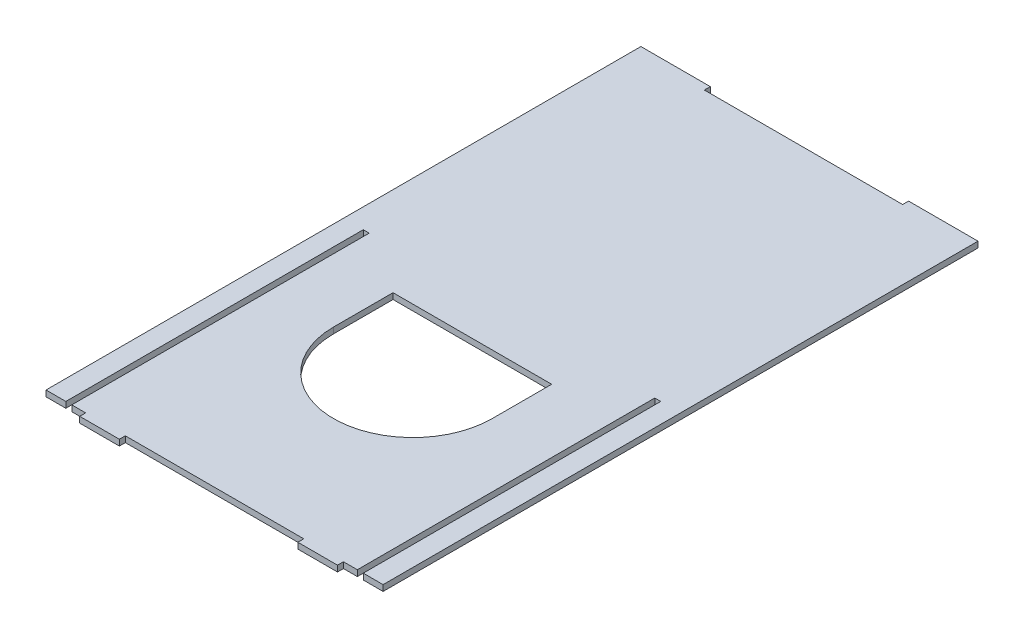
ISO-10303-21;
HEADER;
FILE_DESCRIPTION(('STEP AP214'),'2;1');
FILE_NAME('part.step','',(''),(''),'','','');
FILE_SCHEMA(('AUTOMOTIVE_DESIGN { 1 0 10303 214 1 1 1 1 }'));
ENDSEC;
DATA;
#1=APPLICATION_CONTEXT('core data for automotive mechanical design processes');
#2=APPLICATION_PROTOCOL_DEFINITION('international standard','automotive_design',2000,#1);
#3=PRODUCT_CONTEXT('',#1,'mechanical');
#4=PRODUCT('Part','Part','',(#3));
#5=PRODUCT_RELATED_PRODUCT_CATEGORY('part','',(#4));
#6=PRODUCT_DEFINITION_FORMATION('','',#4);
#7=PRODUCT_DEFINITION_CONTEXT('part definition',#1,'design');
#8=PRODUCT_DEFINITION('design','',#6,#7);
#9=PRODUCT_DEFINITION_SHAPE('','',#8);
#10=(LENGTH_UNIT() NAMED_UNIT(*) SI_UNIT(.MILLI.,.METRE.));
#11=(NAMED_UNIT(*) PLANE_ANGLE_UNIT() SI_UNIT($,.RADIAN.));
#12=(NAMED_UNIT(*) SI_UNIT($,.STERADIAN.) SOLID_ANGLE_UNIT());
#13=UNCERTAINTY_MEASURE_WITH_UNIT(LENGTH_MEASURE(1.E-05),#10,'distance_accuracy_value','');
#14=(GEOMETRIC_REPRESENTATION_CONTEXT(3) GLOBAL_UNCERTAINTY_ASSIGNED_CONTEXT((#13)) GLOBAL_UNIT_ASSIGNED_CONTEXT((#10,
#11,#12)) REPRESENTATION_CONTEXT('',''));
#15=CARTESIAN_POINT('',(0.,0.,0.));
#16=DIRECTION('',(0.,0.,1.));
#17=DIRECTION('',(1.,0.,0.));
#18=AXIS2_PLACEMENT_3D('',#15,#16,#17);
#19=CARTESIAN_POINT('',(0.,6.,-600.));
#20=DIRECTION('',(0.,0.,1.));
#21=DIRECTION('',(1.,0.,0.));
#22=AXIS2_PLACEMENT_3D('',#19,#20,#21);
#23=PLANE('',#22);
#24=DIRECTION('',(-1.,0.,0.));
#25=VECTOR('',#24,1.);
#26=CARTESIAN_POINT('',(0.,6.,-600.));
#27=LINE('',#26,#25);
#28=CARTESIAN_POINT('',(70.,6.,-600.));
#29=VERTEX_POINT('',#28);
#30=CARTESIAN_POINT('',(0.,6.,-600.));
#31=VERTEX_POINT('',#30);
#32=EDGE_CURVE('E363',#29,#31,#27,.T.);
#33=ORIENTED_EDGE('',*,*,#32,.F.);
#34=DIRECTION('',(0.,1.,0.));
#35=VECTOR('',#34,1.);
#36=CARTESIAN_POINT('',(70.,0.,-600.));
#37=LINE('',#36,#35);
#38=CARTESIAN_POINT('',(70.,0.,-600.));
#39=VERTEX_POINT('',#38);
#40=EDGE_CURVE('E270',#39,#29,#37,.T.);
#41=ORIENTED_EDGE('',*,*,#40,.F.);
#42=DIRECTION('',(-1.,0.,0.));
#43=VECTOR('',#42,1.);
#44=CARTESIAN_POINT('',(0.,0.,-600.));
#45=LINE('',#44,#43);
#46=CARTESIAN_POINT('',(0.,0.,-600.));
#47=VERTEX_POINT('',#46);
#48=EDGE_CURVE('E393',#39,#47,#45,.T.);
#49=ORIENTED_EDGE('',*,*,#48,.T.);
#50=DIRECTION('',(0.,-1.,0.));
#51=VECTOR('',#50,1.);
#52=CARTESIAN_POINT('',(0.,6.,-600.));
#53=LINE('',#52,#51);
#54=EDGE_CURVE('E401',#31,#47,#53,.T.);
#55=ORIENTED_EDGE('',*,*,#54,.F.);
#56=EDGE_LOOP('',(#33,#41,#49,#55));
#57=FACE_BOUND('',#56,.T.);
#58=ADVANCED_FACE('F39',(#57),#23,.F.);
#59=CARTESIAN_POINT('',(300.,6.,-2.10463319099841E-13));
#60=DIRECTION('',(0.,0.,-1.));
#61=DIRECTION('',(-1.,0.,0.));
#62=AXIS2_PLACEMENT_3D('',#59,#60,#61);
#63=PLANE('',#62);
#64=DIRECTION('',(1.,0.,0.));
#65=VECTOR('',#64,1.);
#66=CARTESIAN_POINT('',(300.,0.,-2.10463319099841E-13));
#67=LINE('',#66,#65);
#68=CARTESIAN_POINT('',(300.,0.,-2.10463319099841E-13));
#69=VERTEX_POINT('',#68);
#70=CARTESIAN_POINT('',(314.,0.,-3.31505656259168E-13));
#71=VERTEX_POINT('',#70);
#72=EDGE_CURVE('E388',#69,#71,#67,.T.);
#73=ORIENTED_EDGE('',*,*,#72,.T.);
#74=DIRECTION('',(0.,1.,0.));
#75=VECTOR('',#74,1.);
#76=CARTESIAN_POINT('',(314.,0.,-3.31505656259168E-13));
#77=LINE('',#76,#75);
#78=CARTESIAN_POINT('',(314.,6.,-3.31505656259168E-13));
#79=VERTEX_POINT('',#78);
#80=EDGE_CURVE('E297',#71,#79,#77,.T.);
#81=ORIENTED_EDGE('',*,*,#80,.T.);
#82=DIRECTION('',(1.,0.,0.));
#83=VECTOR('',#82,1.);
#84=CARTESIAN_POINT('',(300.,6.,-2.10463319099841E-13));
#85=LINE('',#84,#83);
#86=CARTESIAN_POINT('',(300.,6.,-2.10463319099841E-13));
#87=VERTEX_POINT('',#86);
#88=EDGE_CURVE('E358',#87,#79,#85,.T.);
#89=ORIENTED_EDGE('',*,*,#88,.F.);
#90=DIRECTION('',(0.,-1.,0.));
#91=VECTOR('',#90,1.);
#92=CARTESIAN_POINT('',(300.,6.,-2.10463319099841E-13));
#93=LINE('',#92,#91);
#94=EDGE_CURVE('E410',#87,#69,#93,.T.);
#95=ORIENTED_EDGE('',*,*,#94,.T.);
#96=EDGE_LOOP('',(#73,#81,#89,#95));
#97=FACE_BOUND('',#96,.T.);
#98=ADVANCED_FACE('F521',(#97),#63,.F.);
#99=CARTESIAN_POINT('',(40.,6.,0.));
#100=DIRECTION('',(0.,0.,-1.));
#101=DIRECTION('',(-1.,0.,0.));
#102=AXIS2_PLACEMENT_3D('',#99,#100,#101);
#103=PLANE('',#102);
#104=DIRECTION('',(1.,0.,0.));
#105=VECTOR('',#104,1.);
#106=CARTESIAN_POINT('',(40.,0.,0.));
#107=LINE('',#106,#105);
#108=CARTESIAN_POINT('',(0.,0.,0.));
#109=VERTEX_POINT('',#108);
#110=CARTESIAN_POINT('',(20.,0.,0.));
#111=VERTEX_POINT('',#110);
#112=EDGE_CURVE('E370',#109,#111,#107,.T.);
#113=ORIENTED_EDGE('',*,*,#112,.T.);
#114=DIRECTION('',(0.,1.,0.));
#115=VECTOR('',#114,1.);
#116=CARTESIAN_POINT('',(20.,0.,0.));
#117=LINE('',#116,#115);
#118=CARTESIAN_POINT('',(20.,6.,0.));
#119=VERTEX_POINT('',#118);
#120=EDGE_CURVE('E323',#111,#119,#117,.T.);
#121=ORIENTED_EDGE('',*,*,#120,.T.);
#122=DIRECTION('',(1.,0.,0.));
#123=VECTOR('',#122,1.);
#124=CARTESIAN_POINT('',(40.,6.,0.));
#125=LINE('',#124,#123);
#126=CARTESIAN_POINT('',(0.,6.,0.));
#127=VERTEX_POINT('',#126);
#128=EDGE_CURVE('E339',#127,#119,#125,.T.);
#129=ORIENTED_EDGE('',*,*,#128,.F.);
#130=DIRECTION('',(0.,-1.,0.));
#131=VECTOR('',#130,1.);
#132=CARTESIAN_POINT('',(0.,6.,0.));
#133=LINE('',#132,#131);
#134=EDGE_CURVE('E369',#127,#109,#133,.T.);
#135=ORIENTED_EDGE('',*,*,#134,.T.);
#136=EDGE_LOOP('',(#113,#121,#129,#135));
#137=FACE_BOUND('',#136,.T.);
#138=ADVANCED_FACE('F473',(#137),#103,.F.);
#139=CARTESIAN_POINT('',(26.,6.,0.));
#140=VERTEX_POINT('',#139);
#141=CARTESIAN_POINT('',(40.,6.,0.));
#142=VERTEX_POINT('',#141);
#143=EDGE_CURVE('E343',#140,#142,#125,.T.);
#144=ORIENTED_EDGE('',*,*,#143,.F.);
#145=DIRECTION('',(0.,1.,0.));
#146=VECTOR('',#145,1.);
#147=CARTESIAN_POINT('',(26.,0.,0.));
#148=LINE('',#147,#146);
#149=CARTESIAN_POINT('',(26.,0.,0.));
#150=VERTEX_POINT('',#149);
#151=EDGE_CURVE('E335',#150,#140,#148,.T.);
#152=ORIENTED_EDGE('',*,*,#151,.F.);
#153=CARTESIAN_POINT('',(40.,0.,0.));
#154=VERTEX_POINT('',#153);
#155=EDGE_CURVE('E332',#150,#154,#107,.T.);
#156=ORIENTED_EDGE('',*,*,#155,.T.);
#157=DIRECTION('',(0.,-1.,0.));
#158=VECTOR('',#157,1.);
#159=CARTESIAN_POINT('',(40.,6.,0.));
#160=LINE('',#159,#158);
#161=EDGE_CURVE('E11',#142,#154,#160,.T.);
#162=ORIENTED_EDGE('',*,*,#161,.F.);
#163=EDGE_LOOP('',(#144,#152,#156,#162));
#164=FACE_BOUND('',#163,.T.);
#165=ADVANCED_FACE('F41',(#164),#103,.F.);
#166=CARTESIAN_POINT('',(40.,6.,0.));
#167=DIRECTION('',(1.,0.,0.));
#168=DIRECTION('',(0.,0.,-1.));
#169=AXIS2_PLACEMENT_3D('',#166,#167,#168);
#170=PLANE('',#169);
#171=DIRECTION('',(0.,0.,1.));
#172=VECTOR('',#171,1.);
#173=CARTESIAN_POINT('',(40.,0.,0.));
#174=LINE('',#173,#172);
#175=CARTESIAN_POINT('',(40.,0.,6.00000000000003));
#176=VERTEX_POINT('',#175);
#177=EDGE_CURVE('E373',#154,#176,#174,.T.);
#178=ORIENTED_EDGE('',*,*,#177,.T.);
#179=DIRECTION('',(0.,-1.,0.));
#180=VECTOR('',#179,1.);
#181=CARTESIAN_POINT('',(40.,6.,6.00000000000003));
#182=LINE('',#181,#180);
#183=CARTESIAN_POINT('',(40.,6.,6.00000000000003));
#184=VERTEX_POINT('',#183);
#185=EDGE_CURVE('E47',#184,#176,#182,.T.);
#186=ORIENTED_EDGE('',*,*,#185,.F.);
#187=DIRECTION('',(0.,0.,1.));
#188=VECTOR('',#187,1.);
#189=CARTESIAN_POINT('',(40.,6.,0.));
#190=LINE('',#189,#188);
#191=EDGE_CURVE('E342',#142,#184,#190,.T.);
#192=ORIENTED_EDGE('',*,*,#191,.F.);
#193=ORIENTED_EDGE('',*,*,#161,.T.);
#194=EDGE_LOOP('',(#178,#186,#192,#193));
#195=FACE_BOUND('',#194,.T.);
#196=ADVANCED_FACE('F457',(#195),#170,.F.);
#197=CARTESIAN_POINT('',(40.,6.,6.00000000000003));
#198=DIRECTION('',(0.,0.,-1.));
#199=DIRECTION('',(-1.,0.,0.));
#200=AXIS2_PLACEMENT_3D('',#197,#198,#199);
#201=PLANE('',#200);
#202=DIRECTION('',(1.,0.,0.));
#203=VECTOR('',#202,1.);
#204=CARTESIAN_POINT('',(40.,0.,6.00000000000003));
#205=LINE('',#204,#203);
#206=CARTESIAN_POINT('',(80.,0.,5.99999999999993));
#207=VERTEX_POINT('',#206);
#208=EDGE_CURVE('E375',#176,#207,#205,.T.);
#209=ORIENTED_EDGE('',*,*,#208,.T.);
#210=DIRECTION('',(0.,-1.,0.));
#211=VECTOR('',#210,1.);
#212=CARTESIAN_POINT('',(80.,6.,5.99999999999993));
#213=LINE('',#212,#211);
#214=CARTESIAN_POINT('',(80.,6.,5.99999999999993));
#215=VERTEX_POINT('',#214);
#216=EDGE_CURVE('E425',#215,#207,#213,.T.);
#217=ORIENTED_EDGE('',*,*,#216,.F.);
#218=DIRECTION('',(1.,0.,0.));
#219=VECTOR('',#218,1.);
#220=CARTESIAN_POINT('',(40.,6.,6.00000000000003));
#221=LINE('',#220,#219);
#222=EDGE_CURVE('E345',#184,#215,#221,.T.);
#223=ORIENTED_EDGE('',*,*,#222,.F.);
#224=ORIENTED_EDGE('',*,*,#185,.T.);
#225=EDGE_LOOP('',(#209,#217,#223,#224));
#226=FACE_BOUND('',#225,.T.);
#227=ADVANCED_FACE('F432',(#226),#201,.F.);
#228=CARTESIAN_POINT('',(80.,6.,5.99999999999993));
#229=DIRECTION('',(-1.,0.,0.));
#230=DIRECTION('',(0.,0.,1.));
#231=AXIS2_PLACEMENT_3D('',#228,#229,#230);
#232=PLANE('',#231);
#233=DIRECTION('',(0.,0.,-1.));
#234=VECTOR('',#233,1.);
#235=CARTESIAN_POINT('',(80.,0.,5.99999999999993));
#236=LINE('',#235,#234);
#237=CARTESIAN_POINT('',(80.,0.,0.));
#238=VERTEX_POINT('',#237);
#239=EDGE_CURVE('E377',#207,#238,#236,.T.);
#240=ORIENTED_EDGE('',*,*,#239,.T.);
#241=DIRECTION('',(0.,-1.,0.));
#242=VECTOR('',#241,1.);
#243=CARTESIAN_POINT('',(80.,6.,0.));
#244=LINE('',#243,#242);
#245=CARTESIAN_POINT('',(80.,6.,0.));
#246=VERTEX_POINT('',#245);
#247=EDGE_CURVE('E422',#246,#238,#244,.T.);
#248=ORIENTED_EDGE('',*,*,#247,.F.);
#249=DIRECTION('',(0.,0.,-1.));
#250=VECTOR('',#249,1.);
#251=CARTESIAN_POINT('',(80.,6.,5.99999999999993));
#252=LINE('',#251,#250);
#253=EDGE_CURVE('E347',#215,#246,#252,.T.);
#254=ORIENTED_EDGE('',*,*,#253,.F.);
#255=ORIENTED_EDGE('',*,*,#216,.T.);
#256=EDGE_LOOP('',(#240,#248,#254,#255));
#257=FACE_BOUND('',#256,.T.);
#258=ADVANCED_FACE('F443',(#257),#232,.F.);
#259=CARTESIAN_POINT('',(80.,6.,0.));
#260=DIRECTION('',(0.,0.,-1.));
#261=DIRECTION('',(-1.,0.,0.));
#262=AXIS2_PLACEMENT_3D('',#259,#260,#261);
#263=PLANE('',#262);
#264=DIRECTION('',(1.,0.,0.));
#265=VECTOR('',#264,1.);
#266=CARTESIAN_POINT('',(80.,0.,0.));
#267=LINE('',#266,#265);
#268=CARTESIAN_POINT('',(260.,0.,-1.85615411929518E-13));
#269=VERTEX_POINT('',#268);
#270=EDGE_CURVE('E379',#238,#269,#267,.T.);
#271=ORIENTED_EDGE('',*,*,#270,.T.);
#272=DIRECTION('',(0.,-1.,0.));
#273=VECTOR('',#272,1.);
#274=CARTESIAN_POINT('',(260.,6.,-1.85615411929518E-13));
#275=LINE('',#274,#273);
#276=CARTESIAN_POINT('',(260.,6.,-1.85615411929518E-13));
#277=VERTEX_POINT('',#276);
#278=EDGE_CURVE('E419',#277,#269,#275,.T.);
#279=ORIENTED_EDGE('',*,*,#278,.F.);
#280=DIRECTION('',(1.,0.,0.));
#281=VECTOR('',#280,1.);
#282=CARTESIAN_POINT('',(80.,6.,0.));
#283=LINE('',#282,#281);
#284=EDGE_CURVE('E349',#246,#277,#283,.T.);
#285=ORIENTED_EDGE('',*,*,#284,.F.);
#286=ORIENTED_EDGE('',*,*,#247,.T.);
#287=EDGE_LOOP('',(#271,#279,#285,#286));
#288=FACE_BOUND('',#287,.T.);
#289=ADVANCED_FACE('F447',(#288),#263,.F.);
#290=CARTESIAN_POINT('',(260.,6.,5.99999999999979));
#291=DIRECTION('',(1.,0.,0.));
#292=DIRECTION('',(0.,0.,-1.));
#293=AXIS2_PLACEMENT_3D('',#290,#291,#292);
#294=PLANE('',#293);
#295=DIRECTION('',(0.,0.,1.));
#296=VECTOR('',#295,1.);
#297=CARTESIAN_POINT('',(260.,0.,5.99999999999979));
#298=LINE('',#297,#296);
#299=CARTESIAN_POINT('',(260.,0.,5.99999999999979));
#300=VERTEX_POINT('',#299);
#301=EDGE_CURVE('E381',#269,#300,#298,.T.);
#302=ORIENTED_EDGE('',*,*,#301,.T.);
#303=DIRECTION('',(0.,-1.,0.));
#304=VECTOR('',#303,1.);
#305=CARTESIAN_POINT('',(260.,6.,5.99999999999979));
#306=LINE('',#305,#304);
#307=CARTESIAN_POINT('',(260.,6.,5.99999999999979));
#308=VERTEX_POINT('',#307);
#309=EDGE_CURVE('E416',#308,#300,#306,.T.);
#310=ORIENTED_EDGE('',*,*,#309,.F.);
#311=DIRECTION('',(0.,0.,1.));
#312=VECTOR('',#311,1.);
#313=CARTESIAN_POINT('',(260.,6.,5.99999999999979));
#314=LINE('',#313,#312);
#315=EDGE_CURVE('E351',#277,#308,#314,.T.);
#316=ORIENTED_EDGE('',*,*,#315,.F.);
#317=ORIENTED_EDGE('',*,*,#278,.T.);
#318=EDGE_LOOP('',(#302,#310,#316,#317));
#319=FACE_BOUND('',#318,.T.);
#320=ADVANCED_FACE('F533',(#319),#294,.F.);
#321=CARTESIAN_POINT('',(300.,6.,5.99999999999979));
#322=DIRECTION('',(0.,0.,-1.));
#323=DIRECTION('',(-1.,0.,0.));
#324=AXIS2_PLACEMENT_3D('',#321,#322,#323);
#325=PLANE('',#324);
#326=DIRECTION('',(1.,0.,0.));
#327=VECTOR('',#326,1.);
#328=CARTESIAN_POINT('',(300.,0.,5.99999999999979));
#329=LINE('',#328,#327);
#330=CARTESIAN_POINT('',(300.,0.,5.99999999999979));
#331=VERTEX_POINT('',#330);
#332=EDGE_CURVE('E383',#300,#331,#329,.T.);
#333=ORIENTED_EDGE('',*,*,#332,.T.);
#334=DIRECTION('',(0.,-1.,0.));
#335=VECTOR('',#334,1.);
#336=CARTESIAN_POINT('',(300.,6.,5.99999999999979));
#337=LINE('',#336,#335);
#338=CARTESIAN_POINT('',(300.,6.,5.99999999999979));
#339=VERTEX_POINT('',#338);
#340=EDGE_CURVE('E413',#339,#331,#337,.T.);
#341=ORIENTED_EDGE('',*,*,#340,.F.);
#342=DIRECTION('',(1.,0.,0.));
#343=VECTOR('',#342,1.);
#344=CARTESIAN_POINT('',(300.,6.,5.99999999999979));
#345=LINE('',#344,#343);
#346=EDGE_CURVE('E353',#308,#339,#345,.T.);
#347=ORIENTED_EDGE('',*,*,#346,.F.);
#348=ORIENTED_EDGE('',*,*,#309,.T.);
#349=EDGE_LOOP('',(#333,#341,#347,#348));
#350=FACE_BOUND('',#349,.T.);
#351=ADVANCED_FACE('F530',(#350),#325,.F.);
#352=CARTESIAN_POINT('',(300.,6.,-2.10463319099841E-13));
#353=DIRECTION('',(-1.,0.,0.));
#354=DIRECTION('',(0.,0.,1.));
#355=AXIS2_PLACEMENT_3D('',#352,#353,#354);
#356=PLANE('',#355);
#357=DIRECTION('',(0.,0.,-1.));
#358=VECTOR('',#357,1.);
#359=CARTESIAN_POINT('',(300.,0.,-2.10463319099841E-13));
#360=LINE('',#359,#358);
#361=EDGE_CURVE('E385',#331,#69,#360,.T.);
#362=ORIENTED_EDGE('',*,*,#361,.T.);
#363=ORIENTED_EDGE('',*,*,#94,.F.);
#364=DIRECTION('',(0.,0.,-1.));
#365=VECTOR('',#364,1.);
#366=CARTESIAN_POINT('',(300.,6.,-2.10463319099841E-13));
#367=LINE('',#366,#365);
#368=EDGE_CURVE('E355',#339,#87,#367,.T.);
#369=ORIENTED_EDGE('',*,*,#368,.F.);
#370=ORIENTED_EDGE('',*,*,#340,.T.);
#371=EDGE_LOOP('',(#362,#363,#369,#370));
#372=FACE_BOUND('',#371,.T.);
#373=ADVANCED_FACE('F526',(#372),#356,.F.);
#374=CARTESIAN_POINT('',(320.,6.,-3.31505656259168E-13));
#375=VERTEX_POINT('',#374);
#376=CARTESIAN_POINT('',(340.,6.,0.));
#377=VERTEX_POINT('',#376);
#378=EDGE_CURVE('E357',#375,#377,#85,.T.);
#379=ORIENTED_EDGE('',*,*,#378,.F.);
#380=DIRECTION('',(0.,1.,0.));
#381=VECTOR('',#380,1.);
#382=CARTESIAN_POINT('',(320.,0.,-3.31505656259168E-13));
#383=LINE('',#382,#381);
#384=CARTESIAN_POINT('',(320.,0.,-3.31505656259168E-13));
#385=VERTEX_POINT('',#384);
#386=EDGE_CURVE('E309',#385,#375,#383,.T.);
#387=ORIENTED_EDGE('',*,*,#386,.F.);
#388=CARTESIAN_POINT('',(340.,0.,0.));
#389=VERTEX_POINT('',#388);
#390=EDGE_CURVE('E387',#385,#389,#67,.T.);
#391=ORIENTED_EDGE('',*,*,#390,.T.);
#392=DIRECTION('',(0.,-1.,0.));
#393=VECTOR('',#392,1.);
#394=CARTESIAN_POINT('',(340.,6.,0.));
#395=LINE('',#394,#393);
#396=EDGE_CURVE('E407',#377,#389,#395,.T.);
#397=ORIENTED_EDGE('',*,*,#396,.F.);
#398=EDGE_LOOP('',(#379,#387,#391,#397));
#399=FACE_BOUND('',#398,.T.);
#400=ADVANCED_FACE('F507',(#399),#63,.F.);
#401=CARTESIAN_POINT('',(340.,6.,0.));
#402=DIRECTION('',(-1.,0.,0.));
#403=DIRECTION('',(0.,0.,1.));
#404=AXIS2_PLACEMENT_3D('',#401,#402,#403);
#405=PLANE('',#404);
#406=DIRECTION('',(0.,0.,-1.));
#407=VECTOR('',#406,1.);
#408=CARTESIAN_POINT('',(340.,0.,0.));
#409=LINE('',#408,#407);
#410=CARTESIAN_POINT('',(340.,0.,-600.));
#411=VERTEX_POINT('',#410);
#412=EDGE_CURVE('E391',#389,#411,#409,.T.);
#413=ORIENTED_EDGE('',*,*,#412,.T.);
#414=DIRECTION('',(0.,-1.,0.));
#415=VECTOR('',#414,1.);
#416=CARTESIAN_POINT('',(340.,6.,-600.));
#417=LINE('',#416,#415);
#418=CARTESIAN_POINT('',(340.,6.,-600.));
#419=VERTEX_POINT('',#418);
#420=EDGE_CURVE('E404',#419,#411,#417,.T.);
#421=ORIENTED_EDGE('',*,*,#420,.F.);
#422=DIRECTION('',(0.,0.,-1.));
#423=VECTOR('',#422,1.);
#424=CARTESIAN_POINT('',(340.,6.,0.));
#425=LINE('',#424,#423);
#426=EDGE_CURVE('E361',#377,#419,#425,.T.);
#427=ORIENTED_EDGE('',*,*,#426,.F.);
#428=ORIENTED_EDGE('',*,*,#396,.T.);
#429=EDGE_LOOP('',(#413,#421,#427,#428));
#430=FACE_BOUND('',#429,.T.);
#431=ADVANCED_FACE('F501',(#430),#405,.F.);
#432=CARTESIAN_POINT('',(270.,0.,-600.));
#433=VERTEX_POINT('',#432);
#434=EDGE_CURVE('E394',#411,#433,#45,.T.);
#435=ORIENTED_EDGE('',*,*,#434,.T.);
#436=DIRECTION('',(0.,1.,0.));
#437=VECTOR('',#436,1.);
#438=CARTESIAN_POINT('',(270.,0.,-600.));
#439=LINE('',#438,#437);
#440=CARTESIAN_POINT('',(270.,6.,-600.));
#441=VERTEX_POINT('',#440);
#442=EDGE_CURVE('E267',#433,#441,#439,.T.);
#443=ORIENTED_EDGE('',*,*,#442,.T.);
#444=EDGE_CURVE('E364',#419,#441,#27,.T.);
#445=ORIENTED_EDGE('',*,*,#444,.F.);
#446=ORIENTED_EDGE('',*,*,#420,.T.);
#447=EDGE_LOOP('',(#435,#443,#445,#446));
#448=FACE_BOUND('',#447,.T.);
#449=ADVANCED_FACE('F496',(#448),#23,.F.);
#450=CARTESIAN_POINT('',(0.,6.,0.));
#451=DIRECTION('',(1.,0.,0.));
#452=DIRECTION('',(0.,0.,-1.));
#453=AXIS2_PLACEMENT_3D('',#450,#451,#452);
#454=PLANE('',#453);
#455=DIRECTION('',(0.,0.,1.));
#456=VECTOR('',#455,1.);
#457=CARTESIAN_POINT('',(0.,0.,0.));
#458=LINE('',#457,#456);
#459=EDGE_CURVE('E397',#47,#109,#458,.T.);
#460=ORIENTED_EDGE('',*,*,#459,.T.);
#461=ORIENTED_EDGE('',*,*,#134,.F.);
#462=DIRECTION('',(0.,0.,1.));
#463=VECTOR('',#462,1.);
#464=CARTESIAN_POINT('',(0.,6.,0.));
#465=LINE('',#464,#463);
#466=EDGE_CURVE('E367',#31,#127,#465,.T.);
#467=ORIENTED_EDGE('',*,*,#466,.F.);
#468=ORIENTED_EDGE('',*,*,#54,.T.);
#469=EDGE_LOOP('',(#460,#461,#467,#468));
#470=FACE_BOUND('',#469,.T.);
#471=ADVANCED_FACE('F478',(#470),#454,.F.);
#472=CARTESIAN_POINT('',(0.,6.,0.));
#473=DIRECTION('',(0.,-1.,0.));
#474=DIRECTION('',(0.,0.,-1.));
#475=AXIS2_PLACEMENT_3D('',#472,#473,#474);
#476=PLANE('',#475);
#477=DIRECTION('',(0.,0.,1.));
#478=VECTOR('',#477,1.);
#479=CARTESIAN_POINT('',(90.0000000000001,6.,-200.));
#480=LINE('',#479,#478);
#481=CARTESIAN_POINT('',(90.0000000000001,6.,-260.));
#482=VERTEX_POINT('',#481);
#483=CARTESIAN_POINT('',(90.0000000000001,6.,-200.));
#484=VERTEX_POINT('',#483);
#485=EDGE_CURVE('E251',#482,#484,#480,.T.);
#486=ORIENTED_EDGE('',*,*,#485,.F.);
#487=DIRECTION('',(-1.,0.,0.));
#488=VECTOR('',#487,1.);
#489=CARTESIAN_POINT('',(90.0000000000001,6.,-260.));
#490=LINE('',#489,#488);
#491=CARTESIAN_POINT('',(250.,6.,-260.));
#492=VERTEX_POINT('',#491);
#493=EDGE_CURVE('E54',#492,#482,#490,.T.);
#494=ORIENTED_EDGE('',*,*,#493,.F.);
#495=DIRECTION('',(0.,0.,-1.));
#496=VECTOR('',#495,1.);
#497=CARTESIAN_POINT('',(250.,6.,-200.));
#498=LINE('',#497,#496);
#499=CARTESIAN_POINT('',(250.,6.,-200.));
#500=VERTEX_POINT('',#499);
#501=EDGE_CURVE('E242',#500,#492,#498,.T.);
#502=ORIENTED_EDGE('',*,*,#501,.F.);
#503=CARTESIAN_POINT('',(170.,6.,-200.));
#504=DIRECTION('',(0.,1.,0.));
#505=DIRECTION('',(0.,0.,1.));
#506=AXIS2_PLACEMENT_3D('',#503,#504,#505);
#507=CIRCLE('',#506,80.);
#508=EDGE_CURVE('E245',#484,#500,#507,.T.);
#509=ORIENTED_EDGE('',*,*,#508,.F.);
#510=EDGE_LOOP('',(#486,#494,#502,#509));
#511=FACE_BOUND('',#510,.T.);
#512=DIRECTION('',(1.,0.,0.));
#513=VECTOR('',#512,1.);
#514=CARTESIAN_POINT('',(70.,6.,-594.));
#515=LINE('',#514,#513);
#516=CARTESIAN_POINT('',(70.,6.,-594.));
#517=VERTEX_POINT('',#516);
#518=CARTESIAN_POINT('',(270.,6.,-594.));
#519=VERTEX_POINT('',#518);
#520=EDGE_CURVE('E274',#517,#519,#515,.T.);
#521=ORIENTED_EDGE('',*,*,#520,.F.);
#522=DIRECTION('',(0.,0.,1.));
#523=VECTOR('',#522,1.);
#524=CARTESIAN_POINT('',(70.,6.,-600.));
#525=LINE('',#524,#523);
#526=EDGE_CURVE('E252',#29,#517,#525,.T.);
#527=ORIENTED_EDGE('',*,*,#526,.F.);
#528=ORIENTED_EDGE('',*,*,#32,.T.);
#529=ORIENTED_EDGE('',*,*,#466,.T.);
#530=ORIENTED_EDGE('',*,*,#128,.T.);
#531=DIRECTION('',(0.,0.,1.));
#532=VECTOR('',#531,1.);
#533=CARTESIAN_POINT('',(20.,6.,0.));
#534=LINE('',#533,#532);
#535=CARTESIAN_POINT('',(20.,6.,-300.));
#536=VERTEX_POINT('',#535);
#537=EDGE_CURVE('E306',#536,#119,#534,.T.);
#538=ORIENTED_EDGE('',*,*,#537,.F.);
#539=DIRECTION('',(-1.,0.,0.));
#540=VECTOR('',#539,1.);
#541=CARTESIAN_POINT('',(20.,6.,-300.));
#542=LINE('',#541,#540);
#543=CARTESIAN_POINT('',(26.,6.,-300.));
#544=VERTEX_POINT('',#543);
#545=EDGE_CURVE('E317',#544,#536,#542,.T.);
#546=ORIENTED_EDGE('',*,*,#545,.F.);
#547=DIRECTION('',(0.,0.,-1.));
#548=VECTOR('',#547,1.);
#549=CARTESIAN_POINT('',(26.,6.,0.));
#550=LINE('',#549,#548);
#551=EDGE_CURVE('E325',#140,#544,#550,.T.);
#552=ORIENTED_EDGE('',*,*,#551,.F.);
#553=ORIENTED_EDGE('',*,*,#143,.T.);
#554=ORIENTED_EDGE('',*,*,#191,.T.);
#555=ORIENTED_EDGE('',*,*,#222,.T.);
#556=ORIENTED_EDGE('',*,*,#253,.T.);
#557=ORIENTED_EDGE('',*,*,#284,.T.);
#558=ORIENTED_EDGE('',*,*,#315,.T.);
#559=ORIENTED_EDGE('',*,*,#346,.T.);
#560=ORIENTED_EDGE('',*,*,#368,.T.);
#561=ORIENTED_EDGE('',*,*,#88,.T.);
#562=DIRECTION('',(0.,0.,1.));
#563=VECTOR('',#562,1.);
#564=CARTESIAN_POINT('',(314.,6.,-3.31505656259168E-13));
#565=LINE('',#564,#563);
#566=CARTESIAN_POINT('',(314.,6.,-300.));
#567=VERTEX_POINT('',#566);
#568=EDGE_CURVE('E258',#567,#79,#565,.T.);
#569=ORIENTED_EDGE('',*,*,#568,.F.);
#570=DIRECTION('',(-1.,0.,0.));
#571=VECTOR('',#570,1.);
#572=CARTESIAN_POINT('',(314.,6.,-300.));
#573=LINE('',#572,#571);
#574=CARTESIAN_POINT('',(320.,6.,-300.));
#575=VERTEX_POINT('',#574);
#576=EDGE_CURVE('E291',#575,#567,#573,.T.);
#577=ORIENTED_EDGE('',*,*,#576,.F.);
#578=DIRECTION('',(0.,0.,-1.));
#579=VECTOR('',#578,1.);
#580=CARTESIAN_POINT('',(320.,6.,-3.31505656259168E-13));
#581=LINE('',#580,#579);
#582=EDGE_CURVE('E299',#375,#575,#581,.T.);
#583=ORIENTED_EDGE('',*,*,#582,.F.);
#584=ORIENTED_EDGE('',*,*,#378,.T.);
#585=ORIENTED_EDGE('',*,*,#426,.T.);
#586=ORIENTED_EDGE('',*,*,#444,.T.);
#587=DIRECTION('',(0.,0.,-1.));
#588=VECTOR('',#587,1.);
#589=CARTESIAN_POINT('',(270.,6.,-600.));
#590=LINE('',#589,#588);
#591=EDGE_CURVE('E272',#519,#441,#590,.T.);
#592=ORIENTED_EDGE('',*,*,#591,.F.);
#593=EDGE_LOOP('',(#521,#527,#528,#529,#530,#538,#546,#552,#553,#554,#555,#556,#557,#558,#559,
#560,#561,#569,#577,#583,#584,#585,#586,#592));
#594=FACE_BOUND('',#593,.T.);
#595=ADVANCED_FACE('F452',(#511,#594),#476,.F.);
#596=CARTESIAN_POINT('',(0.,0.,0.));
#597=DIRECTION('',(0.,-1.,0.));
#598=DIRECTION('',(0.,0.,-1.));
#599=AXIS2_PLACEMENT_3D('',#596,#597,#598);
#600=PLANE('',#599);
#601=DIRECTION('',(-1.,0.,0.));
#602=VECTOR('',#601,1.);
#603=CARTESIAN_POINT('',(90.0000000000001,0.,-260.));
#604=LINE('',#603,#602);
#605=CARTESIAN_POINT('',(250.,0.,-260.));
#606=VERTEX_POINT('',#605);
#607=CARTESIAN_POINT('',(90.0000000000001,0.,-260.));
#608=VERTEX_POINT('',#607);
#609=EDGE_CURVE('E226',#606,#608,#604,.T.);
#610=ORIENTED_EDGE('',*,*,#609,.T.);
#611=DIRECTION('',(0.,0.,1.));
#612=VECTOR('',#611,1.);
#613=CARTESIAN_POINT('',(90.0000000000001,0.,-200.));
#614=LINE('',#613,#612);
#615=CARTESIAN_POINT('',(90.0000000000001,0.,-200.));
#616=VERTEX_POINT('',#615);
#617=EDGE_CURVE('E235',#608,#616,#614,.T.);
#618=ORIENTED_EDGE('',*,*,#617,.T.);
#619=CARTESIAN_POINT('',(170.,0.,-200.));
#620=DIRECTION('',(0.,1.,0.));
#621=DIRECTION('',(0.,0.,1.));
#622=AXIS2_PLACEMENT_3D('',#619,#620,#621);
#623=CIRCLE('',#622,80.);
#624=CARTESIAN_POINT('',(250.,0.,-200.));
#625=VERTEX_POINT('',#624);
#626=EDGE_CURVE('E62',#616,#625,#623,.T.);
#627=ORIENTED_EDGE('',*,*,#626,.T.);
#628=DIRECTION('',(0.,0.,-1.));
#629=VECTOR('',#628,1.);
#630=CARTESIAN_POINT('',(250.,0.,-200.));
#631=LINE('',#630,#629);
#632=EDGE_CURVE('E232',#625,#606,#631,.T.);
#633=ORIENTED_EDGE('',*,*,#632,.T.);
#634=EDGE_LOOP('',(#610,#618,#627,#633));
#635=FACE_BOUND('',#634,.T.);
#636=DIRECTION('',(0.,0.,1.));
#637=VECTOR('',#636,1.);
#638=CARTESIAN_POINT('',(70.,0.,-600.));
#639=LINE('',#638,#637);
#640=CARTESIAN_POINT('',(70.,0.,-594.));
#641=VERTEX_POINT('',#640);
#642=EDGE_CURVE('E275',#39,#641,#639,.T.);
#643=ORIENTED_EDGE('',*,*,#642,.T.);
#644=DIRECTION('',(1.,0.,0.));
#645=VECTOR('',#644,1.);
#646=CARTESIAN_POINT('',(70.,0.,-594.));
#647=LINE('',#646,#645);
#648=CARTESIAN_POINT('',(270.,0.,-594.));
#649=VERTEX_POINT('',#648);
#650=EDGE_CURVE('E282',#641,#649,#647,.T.);
#651=ORIENTED_EDGE('',*,*,#650,.T.);
#652=DIRECTION('',(0.,0.,-1.));
#653=VECTOR('',#652,1.);
#654=CARTESIAN_POINT('',(270.,0.,-600.));
#655=LINE('',#654,#653);
#656=EDGE_CURVE('E264',#649,#433,#655,.T.);
#657=ORIENTED_EDGE('',*,*,#656,.T.);
#658=ORIENTED_EDGE('',*,*,#434,.F.);
#659=ORIENTED_EDGE('',*,*,#412,.F.);
#660=ORIENTED_EDGE('',*,*,#390,.F.);
#661=DIRECTION('',(0.,0.,-1.));
#662=VECTOR('',#661,1.);
#663=CARTESIAN_POINT('',(320.,0.,-3.31505656259168E-13));
#664=LINE('',#663,#662);
#665=CARTESIAN_POINT('',(320.,0.,-300.));
#666=VERTEX_POINT('',#665);
#667=EDGE_CURVE('E290',#385,#666,#664,.T.);
#668=ORIENTED_EDGE('',*,*,#667,.T.);
#669=DIRECTION('',(-1.,0.,0.));
#670=VECTOR('',#669,1.);
#671=CARTESIAN_POINT('',(314.,0.,-300.));
#672=LINE('',#671,#670);
#673=CARTESIAN_POINT('',(314.,0.,-300.));
#674=VERTEX_POINT('',#673);
#675=EDGE_CURVE('E294',#666,#674,#672,.T.);
#676=ORIENTED_EDGE('',*,*,#675,.T.);
#677=DIRECTION('',(0.,0.,1.));
#678=VECTOR('',#677,1.);
#679=CARTESIAN_POINT('',(314.,0.,-3.31505656259168E-13));
#680=LINE('',#679,#678);
#681=EDGE_CURVE('E287',#674,#71,#680,.T.);
#682=ORIENTED_EDGE('',*,*,#681,.T.);
#683=ORIENTED_EDGE('',*,*,#72,.F.);
#684=ORIENTED_EDGE('',*,*,#361,.F.);
#685=ORIENTED_EDGE('',*,*,#332,.F.);
#686=ORIENTED_EDGE('',*,*,#301,.F.);
#687=ORIENTED_EDGE('',*,*,#270,.F.);
#688=ORIENTED_EDGE('',*,*,#239,.F.);
#689=ORIENTED_EDGE('',*,*,#208,.F.);
#690=ORIENTED_EDGE('',*,*,#177,.F.);
#691=ORIENTED_EDGE('',*,*,#155,.F.);
#692=DIRECTION('',(0.,0.,-1.));
#693=VECTOR('',#692,1.);
#694=CARTESIAN_POINT('',(26.,0.,0.));
#695=LINE('',#694,#693);
#696=CARTESIAN_POINT('',(26.,0.,-300.));
#697=VERTEX_POINT('',#696);
#698=EDGE_CURVE('E316',#150,#697,#695,.T.);
#699=ORIENTED_EDGE('',*,*,#698,.T.);
#700=DIRECTION('',(-1.,0.,0.));
#701=VECTOR('',#700,1.);
#702=CARTESIAN_POINT('',(20.,0.,-300.));
#703=LINE('',#702,#701);
#704=CARTESIAN_POINT('',(20.,0.,-300.));
#705=VERTEX_POINT('',#704);
#706=EDGE_CURVE('E320',#697,#705,#703,.T.);
#707=ORIENTED_EDGE('',*,*,#706,.T.);
#708=DIRECTION('',(0.,0.,1.));
#709=VECTOR('',#708,1.);
#710=CARTESIAN_POINT('',(20.,0.,0.));
#711=LINE('',#710,#709);
#712=EDGE_CURVE('E313',#705,#111,#711,.T.);
#713=ORIENTED_EDGE('',*,*,#712,.T.);
#714=ORIENTED_EDGE('',*,*,#112,.F.);
#715=ORIENTED_EDGE('',*,*,#459,.F.);
#716=ORIENTED_EDGE('',*,*,#48,.F.);
#717=EDGE_LOOP('',(#643,#651,#657,#658,#659,#660,#668,#676,#682,#683,#684,#685,#686,#687,#688,
#689,#690,#691,#699,#707,#713,#714,#715,#716));
#718=FACE_BOUND('',#717,.T.);
#719=ADVANCED_FACE('F239',(#635,#718),#600,.T.);
#720=CARTESIAN_POINT('',(20.,0.,0.));
#721=DIRECTION('',(-1.,0.,0.));
#722=DIRECTION('',(0.,0.,1.));
#723=AXIS2_PLACEMENT_3D('',#720,#721,#722);
#724=PLANE('',#723);
#725=ORIENTED_EDGE('',*,*,#537,.T.);
#726=ORIENTED_EDGE('',*,*,#120,.F.);
#727=ORIENTED_EDGE('',*,*,#712,.F.);
#728=DIRECTION('',(0.,1.,0.));
#729=VECTOR('',#728,1.);
#730=CARTESIAN_POINT('',(20.,0.,-300.));
#731=LINE('',#730,#729);
#732=EDGE_CURVE('E330',#705,#536,#731,.T.);
#733=ORIENTED_EDGE('',*,*,#732,.T.);
#734=EDGE_LOOP('',(#725,#726,#727,#733));
#735=FACE_BOUND('',#734,.T.);
#736=ADVANCED_FACE('F469',(#735),#724,.F.);
#737=CARTESIAN_POINT('',(20.,0.,-300.));
#738=DIRECTION('',(0.,0.,-1.));
#739=DIRECTION('',(-1.,0.,0.));
#740=AXIS2_PLACEMENT_3D('',#737,#738,#739);
#741=PLANE('',#740);
#742=ORIENTED_EDGE('',*,*,#545,.T.);
#743=ORIENTED_EDGE('',*,*,#732,.F.);
#744=ORIENTED_EDGE('',*,*,#706,.F.);
#745=DIRECTION('',(0.,1.,0.));
#746=VECTOR('',#745,1.);
#747=CARTESIAN_POINT('',(26.,0.,-300.));
#748=LINE('',#747,#746);
#749=EDGE_CURVE('E333',#697,#544,#748,.T.);
#750=ORIENTED_EDGE('',*,*,#749,.T.);
#751=EDGE_LOOP('',(#742,#743,#744,#750));
#752=FACE_BOUND('',#751,.T.);
#753=ADVANCED_FACE('F465',(#752),#741,.F.);
#754=CARTESIAN_POINT('',(26.,0.,0.));
#755=DIRECTION('',(1.,0.,0.));
#756=DIRECTION('',(0.,0.,-1.));
#757=AXIS2_PLACEMENT_3D('',#754,#755,#756);
#758=PLANE('',#757);
#759=ORIENTED_EDGE('',*,*,#551,.T.);
#760=ORIENTED_EDGE('',*,*,#749,.F.);
#761=ORIENTED_EDGE('',*,*,#698,.F.);
#762=ORIENTED_EDGE('',*,*,#151,.T.);
#763=EDGE_LOOP('',(#759,#760,#761,#762));
#764=FACE_BOUND('',#763,.T.);
#765=ADVANCED_FACE('F462',(#764),#758,.F.);
#766=CARTESIAN_POINT('',(314.,0.,-3.31505656259168E-13));
#767=DIRECTION('',(-1.,0.,0.));
#768=DIRECTION('',(0.,0.,1.));
#769=AXIS2_PLACEMENT_3D('',#766,#767,#768);
#770=PLANE('',#769);
#771=ORIENTED_EDGE('',*,*,#568,.T.);
#772=ORIENTED_EDGE('',*,*,#80,.F.);
#773=ORIENTED_EDGE('',*,*,#681,.F.);
#774=DIRECTION('',(0.,1.,0.));
#775=VECTOR('',#774,1.);
#776=CARTESIAN_POINT('',(314.,0.,-300.));
#777=LINE('',#776,#775);
#778=EDGE_CURVE('E304',#674,#567,#777,.T.);
#779=ORIENTED_EDGE('',*,*,#778,.T.);
#780=EDGE_LOOP('',(#771,#772,#773,#779));
#781=FACE_BOUND('',#780,.T.);
#782=ADVANCED_FACE('F635',(#781),#770,.F.);
#783=CARTESIAN_POINT('',(314.,0.,-300.));
#784=DIRECTION('',(0.,0.,-1.));
#785=DIRECTION('',(-1.,0.,0.));
#786=AXIS2_PLACEMENT_3D('',#783,#784,#785);
#787=PLANE('',#786);
#788=ORIENTED_EDGE('',*,*,#576,.T.);
#789=ORIENTED_EDGE('',*,*,#778,.F.);
#790=ORIENTED_EDGE('',*,*,#675,.F.);
#791=DIRECTION('',(0.,1.,0.));
#792=VECTOR('',#791,1.);
#793=CARTESIAN_POINT('',(320.,0.,-300.));
#794=LINE('',#793,#792);
#795=EDGE_CURVE('E307',#666,#575,#794,.T.);
#796=ORIENTED_EDGE('',*,*,#795,.T.);
#797=EDGE_LOOP('',(#788,#789,#790,#796));
#798=FACE_BOUND('',#797,.T.);
#799=ADVANCED_FACE('F515',(#798),#787,.F.);
#800=CARTESIAN_POINT('',(320.,0.,-3.31505656259168E-13));
#801=DIRECTION('',(1.,0.,0.));
#802=DIRECTION('',(0.,0.,-1.));
#803=AXIS2_PLACEMENT_3D('',#800,#801,#802);
#804=PLANE('',#803);
#805=ORIENTED_EDGE('',*,*,#582,.T.);
#806=ORIENTED_EDGE('',*,*,#795,.F.);
#807=ORIENTED_EDGE('',*,*,#667,.F.);
#808=ORIENTED_EDGE('',*,*,#386,.T.);
#809=EDGE_LOOP('',(#805,#806,#807,#808));
#810=FACE_BOUND('',#809,.T.);
#811=ADVANCED_FACE('F510',(#810),#804,.F.);
#812=CARTESIAN_POINT('',(70.,0.,-600.));
#813=DIRECTION('',(-1.,0.,0.));
#814=DIRECTION('',(0.,0.,1.));
#815=AXIS2_PLACEMENT_3D('',#812,#813,#814);
#816=PLANE('',#815);
#817=ORIENTED_EDGE('',*,*,#526,.T.);
#818=DIRECTION('',(0.,1.,0.));
#819=VECTOR('',#818,1.);
#820=CARTESIAN_POINT('',(70.,0.,-594.));
#821=LINE('',#820,#819);
#822=EDGE_CURVE('E262',#641,#517,#821,.T.);
#823=ORIENTED_EDGE('',*,*,#822,.F.);
#824=ORIENTED_EDGE('',*,*,#642,.F.);
#825=ORIENTED_EDGE('',*,*,#40,.T.);
#826=EDGE_LOOP('',(#817,#823,#824,#825));
#827=FACE_BOUND('',#826,.T.);
#828=ADVANCED_FACE('F486',(#827),#816,.F.);
#829=CARTESIAN_POINT('',(270.,0.,-600.));
#830=DIRECTION('',(1.,0.,0.));
#831=DIRECTION('',(0.,0.,-1.));
#832=AXIS2_PLACEMENT_3D('',#829,#830,#831);
#833=PLANE('',#832);
#834=ORIENTED_EDGE('',*,*,#591,.T.);
#835=ORIENTED_EDGE('',*,*,#442,.F.);
#836=ORIENTED_EDGE('',*,*,#656,.F.);
#837=DIRECTION('',(0.,1.,0.));
#838=VECTOR('',#837,1.);
#839=CARTESIAN_POINT('',(270.,0.,-594.));
#840=LINE('',#839,#838);
#841=EDGE_CURVE('E265',#649,#519,#840,.T.);
#842=ORIENTED_EDGE('',*,*,#841,.T.);
#843=EDGE_LOOP('',(#834,#835,#836,#842));
#844=FACE_BOUND('',#843,.T.);
#845=ADVANCED_FACE('F679',(#844),#833,.F.);
#846=CARTESIAN_POINT('',(70.,0.,-594.));
#847=DIRECTION('',(0.,0.,1.));
#848=DIRECTION('',(1.,0.,0.));
#849=AXIS2_PLACEMENT_3D('',#846,#847,#848);
#850=PLANE('',#849);
#851=ORIENTED_EDGE('',*,*,#520,.T.);
#852=ORIENTED_EDGE('',*,*,#841,.F.);
#853=ORIENTED_EDGE('',*,*,#650,.F.);
#854=ORIENTED_EDGE('',*,*,#822,.T.);
#855=EDGE_LOOP('',(#851,#852,#853,#854));
#856=FACE_BOUND('',#855,.T.);
#857=ADVANCED_FACE('F490',(#856),#850,.F.);
#858=CARTESIAN_POINT('',(90.0000000000001,0.,-260.));
#859=DIRECTION('',(0.,0.,-1.));
#860=DIRECTION('',(-1.,0.,0.));
#861=AXIS2_PLACEMENT_3D('',#858,#859,#860);
#862=PLANE('',#861);
#863=ORIENTED_EDGE('',*,*,#493,.T.);
#864=DIRECTION('',(0.,1.,0.));
#865=VECTOR('',#864,1.);
#866=CARTESIAN_POINT('',(90.0000000000001,0.,-260.));
#867=LINE('',#866,#865);
#868=EDGE_CURVE('E222',#608,#482,#867,.T.);
#869=ORIENTED_EDGE('',*,*,#868,.F.);
#870=ORIENTED_EDGE('',*,*,#609,.F.);
#871=DIRECTION('',(0.,1.,0.));
#872=VECTOR('',#871,1.);
#873=CARTESIAN_POINT('',(250.,0.,-260.));
#874=LINE('',#873,#872);
#875=EDGE_CURVE('E256',#606,#492,#874,.T.);
#876=ORIENTED_EDGE('',*,*,#875,.T.);
#877=EDGE_LOOP('',(#863,#869,#870,#876));
#878=FACE_BOUND('',#877,.T.);
#879=ADVANCED_FACE('F224',(#878),#862,.F.);
#880=CARTESIAN_POINT('',(250.,0.,-200.));
#881=DIRECTION('',(1.,0.,0.));
#882=DIRECTION('',(0.,0.,-1.));
#883=AXIS2_PLACEMENT_3D('',#880,#881,#882);
#884=PLANE('',#883);
#885=ORIENTED_EDGE('',*,*,#501,.T.);
#886=ORIENTED_EDGE('',*,*,#875,.F.);
#887=ORIENTED_EDGE('',*,*,#632,.F.);
#888=DIRECTION('',(0.,1.,0.));
#889=VECTOR('',#888,1.);
#890=CARTESIAN_POINT('',(250.,0.,-200.));
#891=LINE('',#890,#889);
#892=EDGE_CURVE('E259',#625,#500,#891,.T.);
#893=ORIENTED_EDGE('',*,*,#892,.T.);
#894=EDGE_LOOP('',(#885,#886,#887,#893));
#895=FACE_BOUND('',#894,.T.);
#896=ADVANCED_FACE('F705',(#895),#884,.F.);
#897=CARTESIAN_POINT('',(170.,0.,-200.));
#898=DIRECTION('',(0.,1.,0.));
#899=DIRECTION('',(0.,0.,1.));
#900=AXIS2_PLACEMENT_3D('',#897,#898,#899);
#901=CYLINDRICAL_SURFACE('',#900,80.);
#902=ORIENTED_EDGE('',*,*,#508,.T.);
#903=ORIENTED_EDGE('',*,*,#892,.F.);
#904=ORIENTED_EDGE('',*,*,#626,.F.);
#905=DIRECTION('',(0.,1.,0.));
#906=VECTOR('',#905,1.);
#907=CARTESIAN_POINT('',(90.0000000000001,0.,-200.));
#908=LINE('',#907,#906);
#909=EDGE_CURVE('E231',#616,#484,#908,.T.);
#910=ORIENTED_EDGE('',*,*,#909,.T.);
#911=EDGE_LOOP('',(#902,#903,#904,#910));
#912=FACE_BOUND('',#911,.T.);
#913=ADVANCED_FACE('F714',(#912),#901,.F.);
#914=CARTESIAN_POINT('',(90.0000000000001,0.,-200.));
#915=DIRECTION('',(-1.,0.,0.));
#916=DIRECTION('',(0.,0.,1.));
#917=AXIS2_PLACEMENT_3D('',#914,#915,#916);
#918=PLANE('',#917);
#919=ORIENTED_EDGE('',*,*,#485,.T.);
#920=ORIENTED_EDGE('',*,*,#909,.F.);
#921=ORIENTED_EDGE('',*,*,#617,.F.);
#922=ORIENTED_EDGE('',*,*,#868,.T.);
#923=EDGE_LOOP('',(#919,#920,#921,#922));
#924=FACE_BOUND('',#923,.T.);
#925=ADVANCED_FACE('F236',(#924),#918,.F.);
#926=CLOSED_SHELL('',(#58,#98,#138,#165,#196,#227,#258,#289,#320,#351,#373,#400,#431,#449,#471,
#595,#719,#736,#753,#765,#782,#799,#811,#828,#845,#857,#879,#896,#913,#925));
#927=MANIFOLD_SOLID_BREP('B2',#926);
#928=ADVANCED_BREP_SHAPE_REPRESENTATION('',(#18,#927),#14);
#929=SHAPE_DEFINITION_REPRESENTATION(#9,#928);
ENDSEC;
END-ISO-10303-21;
